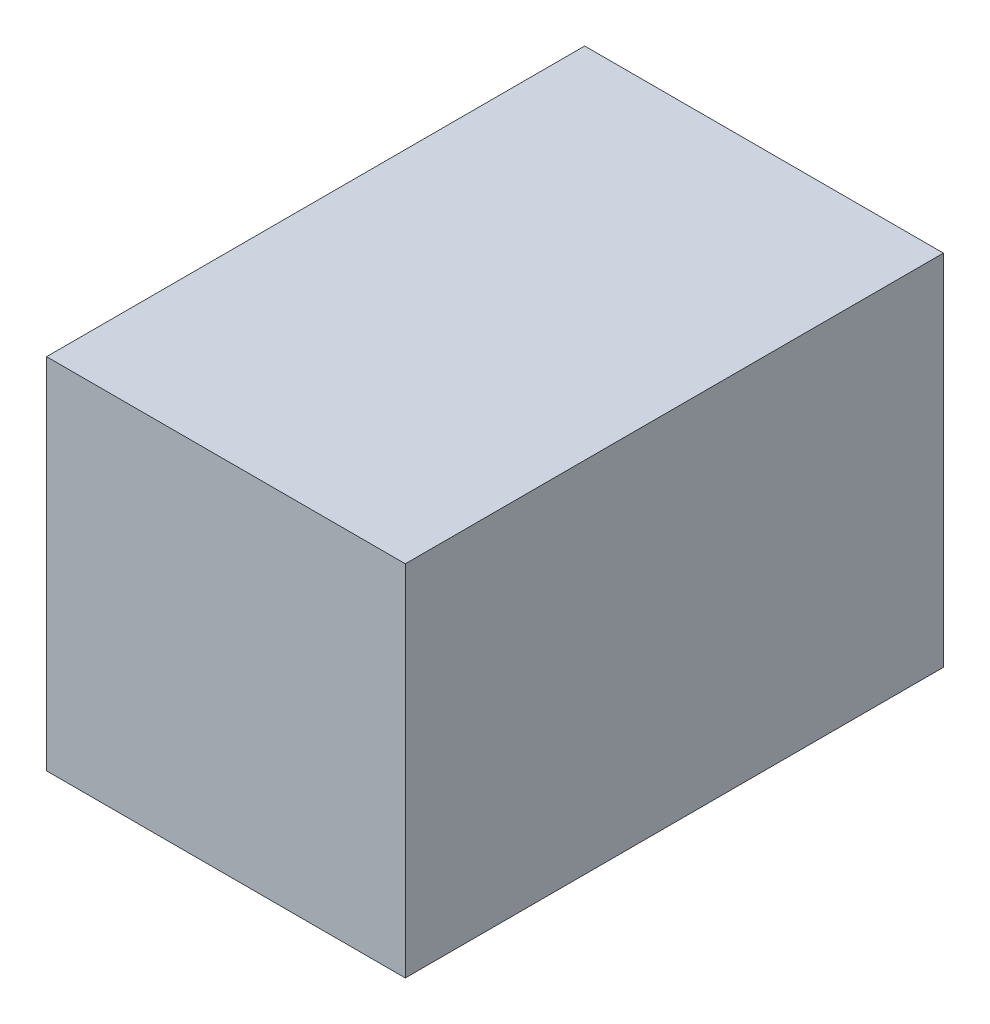
ISO-10303-21;
HEADER;
FILE_DESCRIPTION(('STEP AP214'),'2;1');
FILE_NAME('part.step','',(''),(''),'','','');
FILE_SCHEMA(('AUTOMOTIVE_DESIGN { 1 0 10303 214 1 1 1 1 }'));
ENDSEC;
DATA;
#1=APPLICATION_CONTEXT('core data for automotive mechanical design processes');
#2=APPLICATION_PROTOCOL_DEFINITION('international standard','automotive_design',2000,#1);
#3=PRODUCT_CONTEXT('',#1,'mechanical');
#4=PRODUCT('Part','Part','',(#3));
#5=PRODUCT_RELATED_PRODUCT_CATEGORY('part','',(#4));
#6=PRODUCT_DEFINITION_FORMATION('','',#4);
#7=PRODUCT_DEFINITION_CONTEXT('part definition',#1,'design');
#8=PRODUCT_DEFINITION('design','',#6,#7);
#9=PRODUCT_DEFINITION_SHAPE('','',#8);
#10=(LENGTH_UNIT() NAMED_UNIT(*) SI_UNIT(.MILLI.,.METRE.));
#11=(NAMED_UNIT(*) PLANE_ANGLE_UNIT() SI_UNIT($,.RADIAN.));
#12=(NAMED_UNIT(*) SI_UNIT($,.STERADIAN.) SOLID_ANGLE_UNIT());
#13=UNCERTAINTY_MEASURE_WITH_UNIT(LENGTH_MEASURE(1.E-05),#10,'distance_accuracy_value','');
#14=(GEOMETRIC_REPRESENTATION_CONTEXT(3) GLOBAL_UNCERTAINTY_ASSIGNED_CONTEXT((#13)) GLOBAL_UNIT_ASSIGNED_CONTEXT((#10,
#11,#12)) REPRESENTATION_CONTEXT('',''));
#15=CARTESIAN_POINT('',(0.,0.,0.));
#16=DIRECTION('',(0.,0.,1.));
#17=DIRECTION('',(1.,0.,0.));
#18=AXIS2_PLACEMENT_3D('',#15,#16,#17);
#19=CARTESIAN_POINT('',(0.,0.,0.));
#20=DIRECTION('',(0.,1.,0.));
#21=DIRECTION('',(1.,0.,0.));
#22=AXIS2_PLACEMENT_3D('',#19,#20,#21);
#23=PLANE('',#22);
#24=DIRECTION('',(0.,0.,-1.));
#25=VECTOR('',#24,1.);
#26=CARTESIAN_POINT('',(0.4,0.,-0.6));
#27=LINE('',#26,#25);
#28=CARTESIAN_POINT('',(0.4,0.,0.6));
#29=VERTEX_POINT('',#28);
#30=CARTESIAN_POINT('',(0.4,0.,-0.6));
#31=VERTEX_POINT('',#30);
#32=EDGE_CURVE('E109',#29,#31,#27,.T.);
#33=ORIENTED_EDGE('',*,*,#32,.F.);
#34=DIRECTION('',(1.,0.,0.));
#35=VECTOR('',#34,1.);
#36=CARTESIAN_POINT('',(-0.4,0.,0.6));
#37=LINE('',#36,#35);
#38=CARTESIAN_POINT('',(-0.4,0.,0.6));
#39=VERTEX_POINT('',#38);
#40=EDGE_CURVE('E27',#39,#29,#37,.T.);
#41=ORIENTED_EDGE('',*,*,#40,.F.);
#42=DIRECTION('',(0.,0.,1.));
#43=VECTOR('',#42,1.);
#44=CARTESIAN_POINT('',(-0.4,0.,-0.6));
#45=LINE('',#44,#43);
#46=CARTESIAN_POINT('',(-0.4,0.,-0.6));
#47=VERTEX_POINT('',#46);
#48=EDGE_CURVE('E83',#47,#39,#45,.T.);
#49=ORIENTED_EDGE('',*,*,#48,.F.);
#50=DIRECTION('',(-1.,0.,0.));
#51=VECTOR('',#50,1.);
#52=CARTESIAN_POINT('',(-0.4,0.,-0.6));
#53=LINE('',#52,#51);
#54=EDGE_CURVE('E70',#31,#47,#53,.T.);
#55=ORIENTED_EDGE('',*,*,#54,.F.);
#56=EDGE_LOOP('',(#33,#41,#49,#55));
#57=FACE_BOUND('',#56,.T.);
#58=ADVANCED_FACE('F16',(#57),#23,.F.);
#59=CARTESIAN_POINT('',(0.,0.8,0.));
#60=DIRECTION('',(0.,1.,0.));
#61=DIRECTION('',(1.,0.,0.));
#62=AXIS2_PLACEMENT_3D('',#59,#60,#61);
#63=PLANE('',#62);
#64=DIRECTION('',(0.,0.,-1.));
#65=VECTOR('',#64,1.);
#66=CARTESIAN_POINT('',(0.4,0.8,-0.6));
#67=LINE('',#66,#65);
#68=CARTESIAN_POINT('',(0.4,0.8,0.6));
#69=VERTEX_POINT('',#68);
#70=CARTESIAN_POINT('',(0.4,0.8,-0.6));
#71=VERTEX_POINT('',#70);
#72=EDGE_CURVE('E104',#69,#71,#67,.T.);
#73=ORIENTED_EDGE('',*,*,#72,.T.);
#74=DIRECTION('',(-1.,0.,0.));
#75=VECTOR('',#74,1.);
#76=CARTESIAN_POINT('',(-0.4,0.8,-0.6));
#77=LINE('',#76,#75);
#78=CARTESIAN_POINT('',(-0.4,0.8,-0.6));
#79=VERTEX_POINT('',#78);
#80=EDGE_CURVE('E58',#71,#79,#77,.T.);
#81=ORIENTED_EDGE('',*,*,#80,.T.);
#82=DIRECTION('',(0.,0.,1.));
#83=VECTOR('',#82,1.);
#84=CARTESIAN_POINT('',(-0.4,0.8,-0.6));
#85=LINE('',#84,#83);
#86=CARTESIAN_POINT('',(-0.4,0.8,0.6));
#87=VERTEX_POINT('',#86);
#88=EDGE_CURVE('E92',#79,#87,#85,.T.);
#89=ORIENTED_EDGE('',*,*,#88,.T.);
#90=DIRECTION('',(1.,0.,0.));
#91=VECTOR('',#90,1.);
#92=CARTESIAN_POINT('',(-0.4,0.8,0.6));
#93=LINE('',#92,#91);
#94=EDGE_CURVE('E11',#87,#69,#93,.T.);
#95=ORIENTED_EDGE('',*,*,#94,.T.);
#96=EDGE_LOOP('',(#73,#81,#89,#95));
#97=FACE_BOUND('',#96,.T.);
#98=ADVANCED_FACE('F128',(#97),#63,.T.);
#99=CARTESIAN_POINT('',(-0.4,0.8,0.6));
#100=DIRECTION('',(0.,0.,-1.));
#101=DIRECTION('',(0.,-1.,0.));
#102=AXIS2_PLACEMENT_3D('',#99,#100,#101);
#103=PLANE('',#102);
#104=ORIENTED_EDGE('',*,*,#40,.T.);
#105=DIRECTION('',(0.,-1.,0.));
#106=VECTOR('',#105,1.);
#107=CARTESIAN_POINT('',(0.4,0.8,0.6));
#108=LINE('',#107,#106);
#109=EDGE_CURVE('E20',#69,#29,#108,.T.);
#110=ORIENTED_EDGE('',*,*,#109,.F.);
#111=ORIENTED_EDGE('',*,*,#94,.F.);
#112=DIRECTION('',(0.,-1.,0.));
#113=VECTOR('',#112,1.);
#114=CARTESIAN_POINT('',(-0.4,0.8,0.6));
#115=LINE('',#114,#113);
#116=EDGE_CURVE('E88',#87,#39,#115,.T.);
#117=ORIENTED_EDGE('',*,*,#116,.T.);
#118=EDGE_LOOP('',(#104,#110,#111,#117));
#119=FACE_BOUND('',#118,.T.);
#120=ADVANCED_FACE('F126',(#119),#103,.F.);
#121=CARTESIAN_POINT('',(-0.4,0.8,-0.6));
#122=DIRECTION('',(1.,0.,0.));
#123=DIRECTION('',(0.,0.,-1.));
#124=AXIS2_PLACEMENT_3D('',#121,#122,#123);
#125=PLANE('',#124);
#126=ORIENTED_EDGE('',*,*,#48,.T.);
#127=ORIENTED_EDGE('',*,*,#116,.F.);
#128=ORIENTED_EDGE('',*,*,#88,.F.);
#129=DIRECTION('',(0.,-1.,0.));
#130=VECTOR('',#129,1.);
#131=CARTESIAN_POINT('',(-0.4,0.8,-0.6));
#132=LINE('',#131,#130);
#133=EDGE_CURVE('E90',#79,#47,#132,.T.);
#134=ORIENTED_EDGE('',*,*,#133,.T.);
#135=EDGE_LOOP('',(#126,#127,#128,#134));
#136=FACE_BOUND('',#135,.T.);
#137=ADVANCED_FACE('F91',(#136),#125,.F.);
#138=CARTESIAN_POINT('',(-0.4,0.8,-0.6));
#139=DIRECTION('',(0.,0.,1.));
#140=DIRECTION('',(1.,0.,0.));
#141=AXIS2_PLACEMENT_3D('',#138,#139,#140);
#142=PLANE('',#141);
#143=ORIENTED_EDGE('',*,*,#54,.T.);
#144=ORIENTED_EDGE('',*,*,#133,.F.);
#145=ORIENTED_EDGE('',*,*,#80,.F.);
#146=DIRECTION('',(0.,-1.,0.));
#147=VECTOR('',#146,1.);
#148=CARTESIAN_POINT('',(0.4,0.8,-0.6));
#149=LINE('',#148,#147);
#150=EDGE_CURVE('E96',#71,#31,#149,.T.);
#151=ORIENTED_EDGE('',*,*,#150,.T.);
#152=EDGE_LOOP('',(#143,#144,#145,#151));
#153=FACE_BOUND('',#152,.T.);
#154=ADVANCED_FACE('F18',(#153),#142,.F.);
#155=CARTESIAN_POINT('',(0.4,0.8,-0.6));
#156=DIRECTION('',(-1.,0.,0.));
#157=DIRECTION('',(0.,1.,0.));
#158=AXIS2_PLACEMENT_3D('',#155,#156,#157);
#159=PLANE('',#158);
#160=ORIENTED_EDGE('',*,*,#32,.T.);
#161=ORIENTED_EDGE('',*,*,#150,.F.);
#162=ORIENTED_EDGE('',*,*,#72,.F.);
#163=ORIENTED_EDGE('',*,*,#109,.T.);
#164=EDGE_LOOP('',(#160,#161,#162,#163));
#165=FACE_BOUND('',#164,.T.);
#166=ADVANCED_FACE('F142',(#165),#159,.F.);
#167=CLOSED_SHELL('',(#58,#98,#120,#137,#154,#166));
#168=MANIFOLD_SOLID_BREP('B1',#167);
#169=ADVANCED_BREP_SHAPE_REPRESENTATION('',(#18,#168),#14);
#170=SHAPE_DEFINITION_REPRESENTATION(#9,#169);
ENDSEC;
END-ISO-10303-21;
